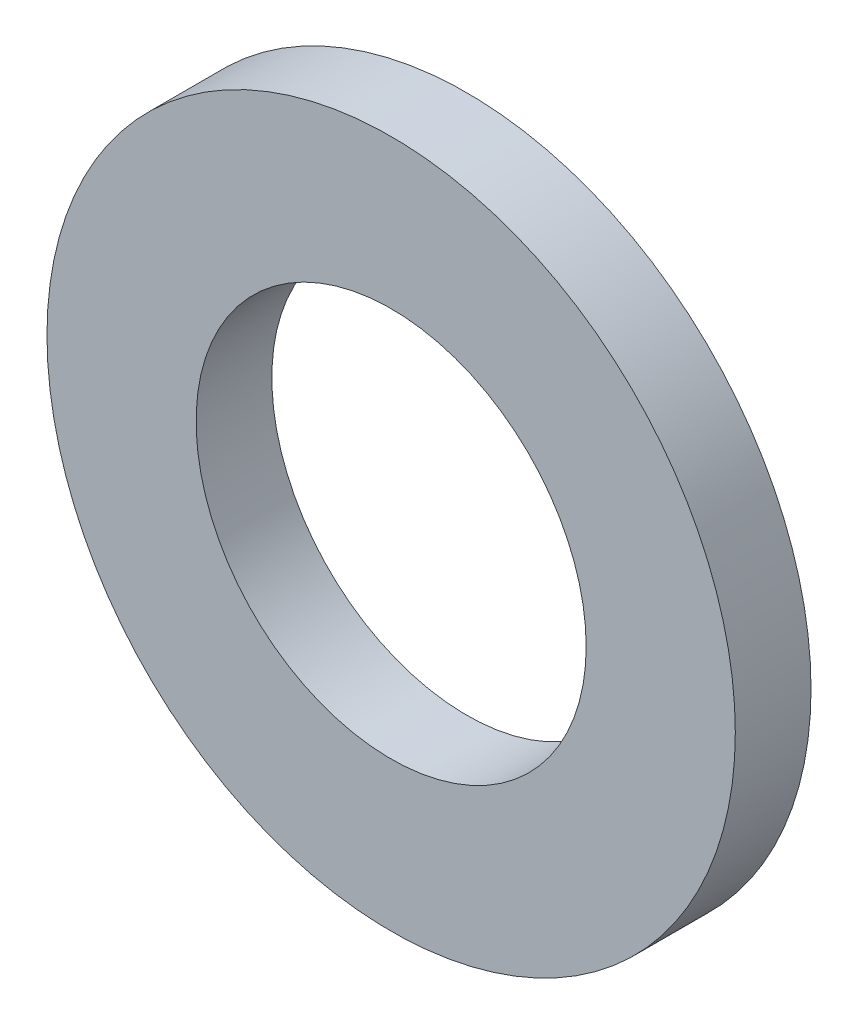
ISO-10303-21;
HEADER;
FILE_DESCRIPTION(('STEP AP214'),'2;1');
FILE_NAME('part.step','',(''),(''),'','','');
FILE_SCHEMA(('AUTOMOTIVE_DESIGN { 1 0 10303 214 1 1 1 1 }'));
ENDSEC;
DATA;
#1=APPLICATION_CONTEXT('core data for automotive mechanical design processes');
#2=APPLICATION_PROTOCOL_DEFINITION('international standard','automotive_design',2000,#1);
#3=PRODUCT_CONTEXT('',#1,'mechanical');
#4=PRODUCT('Part','Part','',(#3));
#5=PRODUCT_RELATED_PRODUCT_CATEGORY('part','',(#4));
#6=PRODUCT_DEFINITION_FORMATION('','',#4);
#7=PRODUCT_DEFINITION_CONTEXT('part definition',#1,'design');
#8=PRODUCT_DEFINITION('design','',#6,#7);
#9=PRODUCT_DEFINITION_SHAPE('','',#8);
#10=(LENGTH_UNIT() NAMED_UNIT(*) SI_UNIT(.MILLI.,.METRE.));
#11=(NAMED_UNIT(*) PLANE_ANGLE_UNIT() SI_UNIT($,.RADIAN.));
#12=(NAMED_UNIT(*) SI_UNIT($,.STERADIAN.) SOLID_ANGLE_UNIT());
#13=UNCERTAINTY_MEASURE_WITH_UNIT(LENGTH_MEASURE(1.E-05),#10,'distance_accuracy_value','');
#14=(GEOMETRIC_REPRESENTATION_CONTEXT(3) GLOBAL_UNCERTAINTY_ASSIGNED_CONTEXT((#13)) GLOBAL_UNIT_ASSIGNED_CONTEXT((#10,
#11,#12)) REPRESENTATION_CONTEXT('',''));
#15=CARTESIAN_POINT('',(0.,0.,0.));
#16=DIRECTION('',(0.,0.,1.));
#17=DIRECTION('',(1.,0.,0.));
#18=AXIS2_PLACEMENT_3D('',#15,#16,#17);
#19=CARTESIAN_POINT('',(0.,0.,3.3));
#20=DIRECTION('',(0.,0.,1.));
#21=DIRECTION('',(1.,0.,0.));
#22=AXIS2_PLACEMENT_3D('',#19,#20,#21);
#23=PLANE('',#22);
#24=CARTESIAN_POINT('',(0.,0.,3.3));
#25=DIRECTION('',(0.,0.,1.));
#26=DIRECTION('',(1.,0.,0.));
#27=AXIS2_PLACEMENT_3D('',#24,#25,#26);
#28=CIRCLE('',#27,15.);
#29=CARTESIAN_POINT('',(15.,0.,3.3));
#30=VERTEX_POINT('',#29);
#31=EDGE_CURVE('E10',#30,#30,#28,.T.);
#32=ORIENTED_EDGE('',*,*,#31,.T.);
#33=EDGE_LOOP('',(#32));
#34=FACE_BOUND('',#33,.T.);
#35=CARTESIAN_POINT('',(0.,0.,3.3));
#36=DIRECTION('',(0.,0.,1.));
#37=DIRECTION('',(1.,0.,0.));
#38=AXIS2_PLACEMENT_3D('',#35,#36,#37);
#39=CIRCLE('',#38,8.5);
#40=CARTESIAN_POINT('',(8.5,0.,3.3));
#41=VERTEX_POINT('',#40);
#42=EDGE_CURVE('E41',#41,#41,#39,.T.);
#43=ORIENTED_EDGE('',*,*,#42,.F.);
#44=EDGE_LOOP('',(#43));
#45=FACE_BOUND('',#44,.T.);
#46=ADVANCED_FACE('F30',(#34,#45),#23,.T.);
#47=CARTESIAN_POINT('',(0.,0.,0.));
#48=DIRECTION('',(0.,0.,1.));
#49=DIRECTION('',(1.,0.,0.));
#50=AXIS2_PLACEMENT_3D('',#47,#48,#49);
#51=PLANE('',#50);
#52=CARTESIAN_POINT('',(0.,0.,0.));
#53=DIRECTION('',(0.,0.,1.));
#54=DIRECTION('',(1.,0.,0.));
#55=AXIS2_PLACEMENT_3D('',#52,#53,#54);
#56=CIRCLE('',#55,15.);
#57=CARTESIAN_POINT('',(15.,0.,0.));
#58=VERTEX_POINT('',#57);
#59=EDGE_CURVE('E34',#58,#58,#56,.T.);
#60=ORIENTED_EDGE('',*,*,#59,.F.);
#61=EDGE_LOOP('',(#60));
#62=FACE_BOUND('',#61,.T.);
#63=CARTESIAN_POINT('',(0.,0.,0.));
#64=DIRECTION('',(0.,0.,1.));
#65=DIRECTION('',(1.,0.,0.));
#66=AXIS2_PLACEMENT_3D('',#63,#64,#65);
#67=CIRCLE('',#66,8.5);
#68=CARTESIAN_POINT('',(8.5,0.,0.));
#69=VERTEX_POINT('',#68);
#70=EDGE_CURVE('E43',#69,#69,#67,.T.);
#71=ORIENTED_EDGE('',*,*,#70,.T.);
#72=EDGE_LOOP('',(#71));
#73=FACE_BOUND('',#72,.T.);
#74=ADVANCED_FACE('F53',(#62,#73),#51,.F.);
#75=CARTESIAN_POINT('',(0.,0.,3.3));
#76=DIRECTION('',(0.,0.,-1.));
#77=DIRECTION('',(-1.,0.,0.));
#78=AXIS2_PLACEMENT_3D('',#75,#76,#77);
#79=CYLINDRICAL_SURFACE('',#78,15.);
#80=ORIENTED_EDGE('',*,*,#31,.F.);
#81=EDGE_LOOP('',(#80));
#82=FACE_BOUND('',#81,.T.);
#83=ORIENTED_EDGE('',*,*,#59,.T.);
#84=EDGE_LOOP('',(#83));
#85=FACE_BOUND('',#84,.T.);
#86=ADVANCED_FACE('F32',(#82,#85),#79,.T.);
#87=CARTESIAN_POINT('',(0.,0.,3.3));
#88=DIRECTION('',(0.,0.,-1.));
#89=DIRECTION('',(-1.,0.,0.));
#90=AXIS2_PLACEMENT_3D('',#87,#88,#89);
#91=CYLINDRICAL_SURFACE('',#90,8.5);
#92=ORIENTED_EDGE('',*,*,#42,.T.);
#93=EDGE_LOOP('',(#92));
#94=FACE_BOUND('',#93,.T.);
#95=ORIENTED_EDGE('',*,*,#70,.F.);
#96=EDGE_LOOP('',(#95));
#97=FACE_BOUND('',#96,.T.);
#98=ADVANCED_FACE('F49',(#94,#97),#91,.F.);
#99=CLOSED_SHELL('',(#46,#74,#86,#98));
#100=MANIFOLD_SOLID_BREP('B2',#99);
#101=ADVANCED_BREP_SHAPE_REPRESENTATION('',(#18,#100),#14);
#102=SHAPE_DEFINITION_REPRESENTATION(#9,#101);
ENDSEC;
END-ISO-10303-21;
